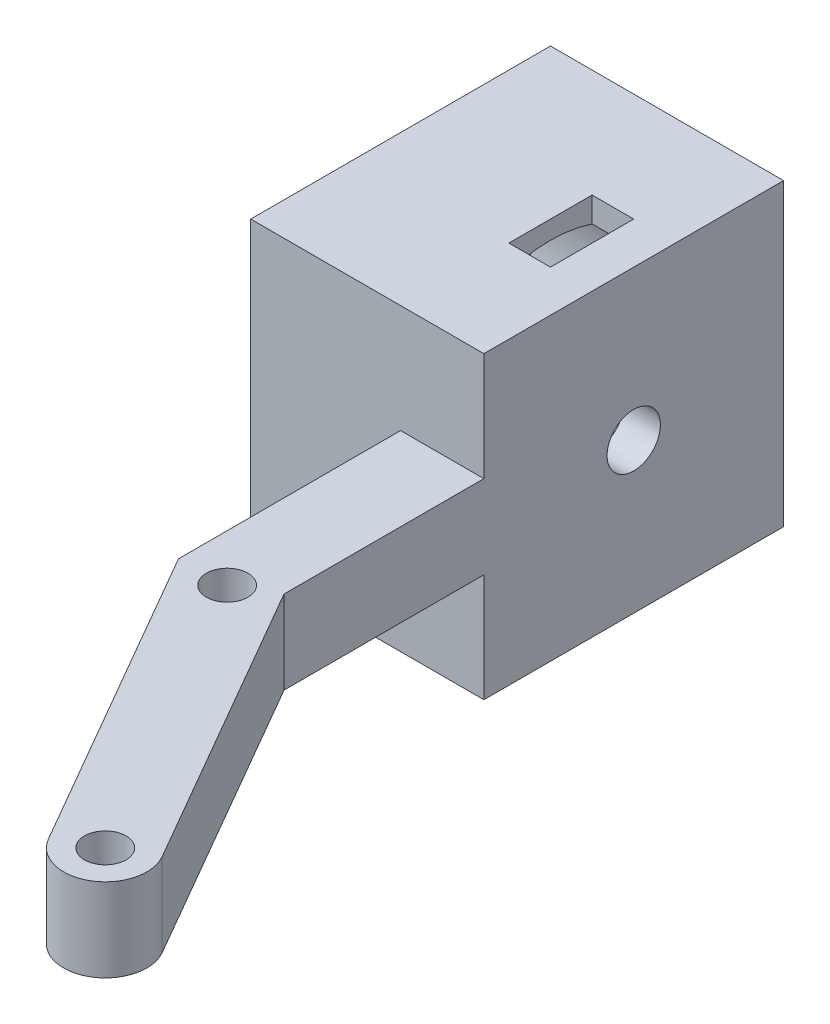
ISO-10303-21;
HEADER;
FILE_DESCRIPTION(('STEP AP214'),'2;1');
FILE_NAME('part.step','',(''),(''),'','','');
FILE_SCHEMA(('AUTOMOTIVE_DESIGN { 1 0 10303 214 1 1 1 1 }'));
ENDSEC;
DATA;
#1=APPLICATION_CONTEXT('core data for automotive mechanical design processes');
#2=APPLICATION_PROTOCOL_DEFINITION('international standard','automotive_design',2000,#1);
#3=PRODUCT_CONTEXT('',#1,'mechanical');
#4=PRODUCT('Part','Part','',(#3));
#5=PRODUCT_RELATED_PRODUCT_CATEGORY('part','',(#4));
#6=PRODUCT_DEFINITION_FORMATION('','',#4);
#7=PRODUCT_DEFINITION_CONTEXT('part definition',#1,'design');
#8=PRODUCT_DEFINITION('design','',#6,#7);
#9=PRODUCT_DEFINITION_SHAPE('','',#8);
#10=(LENGTH_UNIT() NAMED_UNIT(*) SI_UNIT(.MILLI.,.METRE.));
#11=(NAMED_UNIT(*) PLANE_ANGLE_UNIT() SI_UNIT($,.RADIAN.));
#12=(NAMED_UNIT(*) SI_UNIT($,.STERADIAN.) SOLID_ANGLE_UNIT());
#13=UNCERTAINTY_MEASURE_WITH_UNIT(LENGTH_MEASURE(1.E-05),#10,'distance_accuracy_value','');
#14=(GEOMETRIC_REPRESENTATION_CONTEXT(3) GLOBAL_UNCERTAINTY_ASSIGNED_CONTEXT((#13)) GLOBAL_UNIT_ASSIGNED_CONTEXT((#10,
#11,#12)) REPRESENTATION_CONTEXT('',''));
#15=CARTESIAN_POINT('',(0.,0.,0.));
#16=DIRECTION('',(0.,0.,1.));
#17=DIRECTION('',(1.,0.,0.));
#18=AXIS2_PLACEMENT_3D('',#15,#16,#17);
#19=CARTESIAN_POINT('',(-6.35,22.86,14.4014773719376));
#20=DIRECTION('',(0.866025403784442,0.,-0.499999999999995));
#21=DIRECTION('',(-0.499999999999995,0.,-0.866025403784442));
#22=AXIS2_PLACEMENT_3D('',#19,#20,#21);
#23=PLANE('',#22);
#24=DIRECTION('',(-0.5,0.,-0.866025403784439));
#25=VECTOR('',#24,1.);
#26=CARTESIAN_POINT('',(-6.35,8.255,14.4014773719376));
#27=LINE('',#26,#25);
#28=CARTESIAN_POINT('',(7.20073868596881,8.255,37.8720452561247));
#29=VERTEX_POINT('',#28);
#30=CARTESIAN_POINT('',(-6.35,8.255,14.4014773719376));
#31=VERTEX_POINT('',#30);
#32=EDGE_CURVE('E210',#29,#31,#27,.T.);
#33=ORIENTED_EDGE('',*,*,#32,.F.);
#34=DIRECTION('',(0.,-1.,0.));
#35=VECTOR('',#34,1.);
#36=CARTESIAN_POINT('',(7.20073868596866,22.86,37.8720452561248));
#37=LINE('',#36,#35);
#38=CARTESIAN_POINT('',(7.20073868596881,14.605,37.8720452561247));
#39=VERTEX_POINT('',#38);
#40=EDGE_CURVE('E11',#39,#29,#37,.T.);
#41=ORIENTED_EDGE('',*,*,#40,.F.);
#42=DIRECTION('',(0.5,0.,0.866025403784438));
#43=VECTOR('',#42,1.);
#44=CARTESIAN_POINT('',(-6.35,14.605,14.4014773719376));
#45=LINE('',#44,#43);
#46=CARTESIAN_POINT('',(-6.35,14.605,14.4014773719376));
#47=VERTEX_POINT('',#46);
#48=EDGE_CURVE('E241',#47,#39,#45,.T.);
#49=ORIENTED_EDGE('',*,*,#48,.F.);
#50=DIRECTION('',(0.,-1.,0.));
#51=VECTOR('',#50,1.);
#52=CARTESIAN_POINT('',(-6.35,22.86,14.4014773719376));
#53=LINE('',#52,#51);
#54=EDGE_CURVE('E274',#47,#31,#53,.T.);
#55=ORIENTED_EDGE('',*,*,#54,.T.);
#56=EDGE_LOOP('',(#33,#41,#49,#55));
#57=FACE_BOUND('',#56,.T.);
#58=ADVANCED_FACE('F45',(#57),#23,.F.);
#59=CARTESIAN_POINT('',(9.95036934298427,22.86,36.2845452561248));
#60=DIRECTION('',(0.,-1.,0.));
#61=DIRECTION('',(0.,0.,-1.));
#62=AXIS2_PLACEMENT_3D('',#59,#60,#61);
#63=CYLINDRICAL_SURFACE('',#62,3.175);
#64=CARTESIAN_POINT('',(9.95036934298427,8.255,36.2845452561248));
#65=DIRECTION('',(0.,-1.,0.));
#66=DIRECTION('',(0.,0.,-1.));
#67=AXIS2_PLACEMENT_3D('',#64,#65,#66);
#68=CIRCLE('',#67,3.175);
#69=CARTESIAN_POINT('',(12.6999999999999,8.255,34.6970452561248));
#70=VERTEX_POINT('',#69);
#71=EDGE_CURVE('E228',#70,#29,#68,.T.);
#72=ORIENTED_EDGE('',*,*,#71,.F.);
#73=DIRECTION('',(0.,-1.,0.));
#74=VECTOR('',#73,1.);
#75=CARTESIAN_POINT('',(12.6999999999999,22.86,34.6970452561248));
#76=LINE('',#75,#74);
#77=CARTESIAN_POINT('',(12.6999999999999,14.605,34.6970452561248));
#78=VERTEX_POINT('',#77);
#79=EDGE_CURVE('E54',#78,#70,#76,.T.);
#80=ORIENTED_EDGE('',*,*,#79,.F.);
#81=CARTESIAN_POINT('',(9.95036934298427,14.605,36.2845452561248));
#82=DIRECTION('',(0.,1.,0.));
#83=DIRECTION('',(0.,0.,1.));
#84=AXIS2_PLACEMENT_3D('',#81,#82,#83);
#85=CIRCLE('',#84,3.175);
#86=EDGE_CURVE('E257',#39,#78,#85,.T.);
#87=ORIENTED_EDGE('',*,*,#86,.F.);
#88=ORIENTED_EDGE('',*,*,#40,.T.);
#89=EDGE_LOOP('',(#72,#80,#87,#88));
#90=FACE_BOUND('',#89,.T.);
#91=ADVANCED_FACE('F335',(#90),#63,.T.);
#92=CARTESIAN_POINT('',(0.,22.86,12.7));
#93=DIRECTION('',(-0.866025403784441,0.,0.499999999999995));
#94=DIRECTION('',(0.499999999999995,0.,0.866025403784442));
#95=AXIS2_PLACEMENT_3D('',#92,#93,#94);
#96=PLANE('',#95);
#97=DIRECTION('',(0.499999999999995,0.,0.866025403784441));
#98=VECTOR('',#97,1.);
#99=CARTESIAN_POINT('',(0.,8.255,12.7));
#100=LINE('',#99,#98);
#101=CARTESIAN_POINT('',(0.,8.255,12.7));
#102=VERTEX_POINT('',#101);
#103=EDGE_CURVE('E207',#102,#70,#100,.T.);
#104=ORIENTED_EDGE('',*,*,#103,.F.);
#105=DIRECTION('',(0.,-1.,0.));
#106=VECTOR('',#105,1.);
#107=CARTESIAN_POINT('',(0.,22.86,12.7));
#108=LINE('',#107,#106);
#109=CARTESIAN_POINT('',(0.,14.605,12.7));
#110=VERTEX_POINT('',#109);
#111=EDGE_CURVE('E304',#110,#102,#108,.T.);
#112=ORIENTED_EDGE('',*,*,#111,.F.);
#113=DIRECTION('',(-0.499999999999996,0.,-0.866025403784441));
#114=VECTOR('',#113,1.);
#115=CARTESIAN_POINT('',(0.,14.605,12.7));
#116=LINE('',#115,#114);
#117=EDGE_CURVE('E245',#78,#110,#116,.T.);
#118=ORIENTED_EDGE('',*,*,#117,.F.);
#119=ORIENTED_EDGE('',*,*,#79,.T.);
#120=EDGE_LOOP('',(#104,#112,#118,#119));
#121=FACE_BOUND('',#120,.T.);
#122=ADVANCED_FACE('F333',(#121),#96,.F.);
#123=CARTESIAN_POINT('',(-6.35,22.86,14.4014773719376));
#124=DIRECTION('',(1.,0.,0.));
#125=DIRECTION('',(0.,0.,-1.));
#126=AXIS2_PLACEMENT_3D('',#123,#124,#125);
#127=PLANE('',#126);
#128=DIRECTION('',(0.,0.,-1.));
#129=VECTOR('',#128,1.);
#130=CARTESIAN_POINT('',(-6.35,8.255,-2.54));
#131=LINE('',#130,#129);
#132=CARTESIAN_POINT('',(-6.35,8.255,-2.54));
#133=VERTEX_POINT('',#132);
#134=EDGE_CURVE('E213',#31,#133,#131,.T.);
#135=ORIENTED_EDGE('',*,*,#134,.F.);
#136=ORIENTED_EDGE('',*,*,#54,.F.);
#137=DIRECTION('',(0.,0.,1.));
#138=VECTOR('',#137,1.);
#139=CARTESIAN_POINT('',(-6.35,14.605,14.4014773719376));
#140=LINE('',#139,#138);
#141=CARTESIAN_POINT('',(-6.35,14.605,-2.54));
#142=VERTEX_POINT('',#141);
#143=EDGE_CURVE('E238',#142,#47,#140,.T.);
#144=ORIENTED_EDGE('',*,*,#143,.F.);
#145=DIRECTION('',(0.,-1.,0.));
#146=VECTOR('',#145,1.);
#147=CARTESIAN_POINT('',(-6.35,22.86,-2.54));
#148=LINE('',#147,#146);
#149=EDGE_CURVE('E288',#142,#133,#148,.T.);
#150=ORIENTED_EDGE('',*,*,#149,.T.);
#151=EDGE_LOOP('',(#135,#136,#144,#150));
#152=FACE_BOUND('',#151,.T.);
#153=ADVANCED_FACE('F343',(#152),#127,.F.);
#154=CARTESIAN_POINT('',(9.95036934298427,22.86,36.2845452561248));
#155=DIRECTION('',(0.,-1.,0.));
#156=DIRECTION('',(0.,0.,-1.));
#157=AXIS2_PLACEMENT_3D('',#154,#155,#156);
#158=CYLINDRICAL_SURFACE('',#157,1.5875);
#159=CARTESIAN_POINT('',(9.95036934298427,14.605,36.2845452561248));
#160=DIRECTION('',(0.,1.,0.));
#161=DIRECTION('',(0.,0.,1.));
#162=AXIS2_PLACEMENT_3D('',#159,#160,#161);
#163=CIRCLE('',#162,1.5875);
#164=CARTESIAN_POINT('',(9.95036934298427,14.605,37.8720452561248));
#165=VERTEX_POINT('',#164);
#166=EDGE_CURVE('E253',#165,#165,#163,.T.);
#167=ORIENTED_EDGE('',*,*,#166,.T.);
#168=EDGE_LOOP('',(#167));
#169=FACE_BOUND('',#168,.T.);
#170=CARTESIAN_POINT('',(9.95036934298427,8.255,36.2845452561248));
#171=DIRECTION('',(0.,-1.,0.));
#172=DIRECTION('',(0.,0.,-1.));
#173=AXIS2_PLACEMENT_3D('',#170,#171,#172);
#174=CIRCLE('',#173,1.5875);
#175=CARTESIAN_POINT('',(9.95036934298427,8.255,34.6970452561248));
#176=VERTEX_POINT('',#175);
#177=EDGE_CURVE('E224',#176,#176,#174,.T.);
#178=ORIENTED_EDGE('',*,*,#177,.T.);
#179=EDGE_LOOP('',(#178));
#180=FACE_BOUND('',#179,.T.);
#181=ADVANCED_FACE('F375',(#169,#180),#158,.F.);
#182=CARTESIAN_POINT('',(-2.7496306570156,22.86,14.2875));
#183=DIRECTION('',(0.,-1.,0.));
#184=DIRECTION('',(0.,0.,-1.));
#185=AXIS2_PLACEMENT_3D('',#182,#183,#184);
#186=CYLINDRICAL_SURFACE('',#185,1.5875);
#187=CARTESIAN_POINT('',(-2.7496306570156,14.605,14.2875));
#188=DIRECTION('',(0.,1.,0.));
#189=DIRECTION('',(0.,0.,1.));
#190=AXIS2_PLACEMENT_3D('',#187,#188,#189);
#191=CIRCLE('',#190,1.5875);
#192=CARTESIAN_POINT('',(-2.7496306570156,14.605,15.875));
#193=VERTEX_POINT('',#192);
#194=EDGE_CURVE('E252',#193,#193,#191,.T.);
#195=ORIENTED_EDGE('',*,*,#194,.T.);
#196=EDGE_LOOP('',(#195));
#197=FACE_BOUND('',#196,.T.);
#198=CARTESIAN_POINT('',(-2.7496306570156,8.255,14.2875));
#199=DIRECTION('',(0.,-1.,0.));
#200=DIRECTION('',(0.,0.,-1.));
#201=AXIS2_PLACEMENT_3D('',#198,#199,#200);
#202=CIRCLE('',#201,1.5875);
#203=CARTESIAN_POINT('',(-2.7496306570156,8.255,12.7));
#204=VERTEX_POINT('',#203);
#205=EDGE_CURVE('E220',#204,#204,#202,.T.);
#206=ORIENTED_EDGE('',*,*,#205,.T.);
#207=EDGE_LOOP('',(#206));
#208=FACE_BOUND('',#207,.T.);
#209=ADVANCED_FACE('F314',(#197,#208),#186,.F.);
#210=CARTESIAN_POINT('',(9.95036934298427,22.86,36.2845452561248));
#211=DIRECTION('',(0.,1.,0.));
#212=DIRECTION('',(0.,0.,1.));
#213=AXIS2_PLACEMENT_3D('',#210,#211,#212);
#214=PLANE('',#213);
#215=DIRECTION('',(-1.,0.,0.));
#216=VECTOR('',#215,1.);
#217=CARTESIAN_POINT('',(-6.35,22.86,-17.145));
#218=LINE('',#217,#216);
#219=CARTESIAN_POINT('',(-3.175,22.86,-17.145));
#220=VERTEX_POINT('',#219);
#221=CARTESIAN_POINT('',(-6.35,22.86,-17.145));
#222=VERTEX_POINT('',#221);
#223=EDGE_CURVE('E150',#220,#222,#218,.T.);
#224=ORIENTED_EDGE('',*,*,#223,.F.);
#225=DIRECTION('',(0.,0.,-1.));
#226=VECTOR('',#225,1.);
#227=CARTESIAN_POINT('',(-3.175,22.86,-10.795));
#228=LINE('',#227,#226);
#229=CARTESIAN_POINT('',(-3.175,22.86,-10.795));
#230=VERTEX_POINT('',#229);
#231=EDGE_CURVE('E159',#230,#220,#228,.T.);
#232=ORIENTED_EDGE('',*,*,#231,.F.);
#233=DIRECTION('',(1.,0.,0.));
#234=VECTOR('',#233,1.);
#235=CARTESIAN_POINT('',(-6.35,22.86,-10.795));
#236=LINE('',#235,#234);
#237=CARTESIAN_POINT('',(-6.35,22.86,-10.795));
#238=VERTEX_POINT('',#237);
#239=EDGE_CURVE('E62',#238,#230,#236,.T.);
#240=ORIENTED_EDGE('',*,*,#239,.F.);
#241=DIRECTION('',(0.,0.,1.));
#242=VECTOR('',#241,1.);
#243=CARTESIAN_POINT('',(-6.35,22.86,-10.795));
#244=LINE('',#243,#242);
#245=EDGE_CURVE('E169',#222,#238,#244,.T.);
#246=ORIENTED_EDGE('',*,*,#245,.F.);
#247=EDGE_LOOP('',(#224,#232,#240,#246));
#248=FACE_BOUND('',#247,.T.);
#249=DIRECTION('',(1.,0.,0.));
#250=VECTOR('',#249,1.);
#251=CARTESIAN_POINT('',(-17.78,22.86,-2.54));
#252=LINE('',#251,#250);
#253=CARTESIAN_POINT('',(-17.78,22.86,-2.54));
#254=VERTEX_POINT('',#253);
#255=CARTESIAN_POINT('',(0.,22.86,-2.54));
#256=VERTEX_POINT('',#255);
#257=EDGE_CURVE('E271',#254,#256,#252,.T.);
#258=ORIENTED_EDGE('',*,*,#257,.T.);
#259=DIRECTION('',(0.,0.,-1.));
#260=VECTOR('',#259,1.);
#261=CARTESIAN_POINT('',(0.,22.86,12.7));
#262=LINE('',#261,#260);
#263=CARTESIAN_POINT('',(0.,22.86,-25.4));
#264=VERTEX_POINT('',#263);
#265=EDGE_CURVE('E261',#256,#264,#262,.T.);
#266=ORIENTED_EDGE('',*,*,#265,.T.);
#267=DIRECTION('',(-1.,0.,0.));
#268=VECTOR('',#267,1.);
#269=CARTESIAN_POINT('',(0.,22.86,-25.4));
#270=LINE('',#269,#268);
#271=CARTESIAN_POINT('',(-17.78,22.86,-25.4));
#272=VERTEX_POINT('',#271);
#273=EDGE_CURVE('E264',#264,#272,#270,.T.);
#274=ORIENTED_EDGE('',*,*,#273,.T.);
#275=DIRECTION('',(0.,0.,1.));
#276=VECTOR('',#275,1.);
#277=CARTESIAN_POINT('',(-17.78,22.86,-25.4));
#278=LINE('',#277,#276);
#279=EDGE_CURVE('E268',#272,#254,#278,.T.);
#280=ORIENTED_EDGE('',*,*,#279,.T.);
#281=EDGE_LOOP('',(#258,#266,#274,#280));
#282=FACE_BOUND('',#281,.T.);
#283=ADVANCED_FACE('F166',(#248,#282),#214,.T.);
#284=CARTESIAN_POINT('',(9.95036934298427,0.,36.2845452561248));
#285=DIRECTION('',(0.,1.,0.));
#286=DIRECTION('',(0.,0.,1.));
#287=AXIS2_PLACEMENT_3D('',#284,#285,#286);
#288=PLANE('',#287);
#289=DIRECTION('',(0.,0.,-1.));
#290=VECTOR('',#289,1.);
#291=CARTESIAN_POINT('',(0.,0.,12.7));
#292=LINE('',#291,#290);
#293=CARTESIAN_POINT('',(0.,0.,-2.54));
#294=VERTEX_POINT('',#293);
#295=CARTESIAN_POINT('',(0.,0.,-25.4));
#296=VERTEX_POINT('',#295);
#297=EDGE_CURVE('E260',#294,#296,#292,.T.);
#298=ORIENTED_EDGE('',*,*,#297,.F.);
#299=DIRECTION('',(1.,0.,0.));
#300=VECTOR('',#299,1.);
#301=CARTESIAN_POINT('',(-17.78,0.,-2.54));
#302=LINE('',#301,#300);
#303=CARTESIAN_POINT('',(-17.78,0.,-2.54));
#304=VERTEX_POINT('',#303);
#305=EDGE_CURVE('E265',#304,#294,#302,.T.);
#306=ORIENTED_EDGE('',*,*,#305,.F.);
#307=DIRECTION('',(0.,0.,1.));
#308=VECTOR('',#307,1.);
#309=CARTESIAN_POINT('',(-17.78,0.,-25.4));
#310=LINE('',#309,#308);
#311=CARTESIAN_POINT('',(-17.78,0.,-25.4));
#312=VERTEX_POINT('',#311);
#313=EDGE_CURVE('E280',#312,#304,#310,.T.);
#314=ORIENTED_EDGE('',*,*,#313,.F.);
#315=DIRECTION('',(-1.,0.,0.));
#316=VECTOR('',#315,1.);
#317=CARTESIAN_POINT('',(0.,0.,-25.4));
#318=LINE('',#317,#316);
#319=EDGE_CURVE('E277',#296,#312,#318,.T.);
#320=ORIENTED_EDGE('',*,*,#319,.F.);
#321=EDGE_LOOP('',(#298,#306,#314,#320));
#322=FACE_BOUND('',#321,.T.);
#323=ADVANCED_FACE('F355',(#322),#288,.F.);
#324=CARTESIAN_POINT('',(0.,22.86,12.7));
#325=DIRECTION('',(-1.,0.,0.));
#326=DIRECTION('',(0.,0.,1.));
#327=AXIS2_PLACEMENT_3D('',#324,#325,#326);
#328=PLANE('',#327);
#329=CARTESIAN_POINT('',(0.,11.43,-13.97));
#330=DIRECTION('',(1.,0.,0.));
#331=DIRECTION('',(0.,0.,-1.));
#332=AXIS2_PLACEMENT_3D('',#329,#330,#331);
#333=CIRCLE('',#332,2.032);
#334=CARTESIAN_POINT('',(0.,11.43,-16.002));
#335=VERTEX_POINT('',#334);
#336=EDGE_CURVE('E180',#335,#335,#333,.T.);
#337=ORIENTED_EDGE('',*,*,#336,.F.);
#338=EDGE_LOOP('',(#337));
#339=FACE_BOUND('',#338,.T.);
#340=DIRECTION('',(0.,0.,1.));
#341=VECTOR('',#340,1.);
#342=CARTESIAN_POINT('',(0.,8.255,-2.54));
#343=LINE('',#342,#341);
#344=CARTESIAN_POINT('',(0.,8.255,-2.54));
#345=VERTEX_POINT('',#344);
#346=EDGE_CURVE('E204',#345,#102,#343,.T.);
#347=ORIENTED_EDGE('',*,*,#346,.F.);
#348=DIRECTION('',(0.,-1.,0.));
#349=VECTOR('',#348,1.);
#350=CARTESIAN_POINT('',(0.,8.255,-2.54));
#351=LINE('',#350,#349);
#352=EDGE_CURVE('E216',#345,#294,#351,.T.);
#353=ORIENTED_EDGE('',*,*,#352,.T.);
#354=ORIENTED_EDGE('',*,*,#297,.T.);
#355=DIRECTION('',(0.,-1.,0.));
#356=VECTOR('',#355,1.);
#357=CARTESIAN_POINT('',(0.,22.86,-25.4));
#358=LINE('',#357,#356);
#359=EDGE_CURVE('E300',#264,#296,#358,.T.);
#360=ORIENTED_EDGE('',*,*,#359,.F.);
#361=ORIENTED_EDGE('',*,*,#265,.F.);
#362=DIRECTION('',(0.,1.,0.));
#363=VECTOR('',#362,1.);
#364=CARTESIAN_POINT('',(0.,14.605,-2.54));
#365=LINE('',#364,#363);
#366=CARTESIAN_POINT('',(0.,14.605,-2.54));
#367=VERTEX_POINT('',#366);
#368=EDGE_CURVE('E248',#367,#256,#365,.T.);
#369=ORIENTED_EDGE('',*,*,#368,.F.);
#370=DIRECTION('',(0.,0.,-1.));
#371=VECTOR('',#370,1.);
#372=CARTESIAN_POINT('',(0.,14.605,-2.54));
#373=LINE('',#372,#371);
#374=EDGE_CURVE('E231',#110,#367,#373,.T.);
#375=ORIENTED_EDGE('',*,*,#374,.F.);
#376=ORIENTED_EDGE('',*,*,#111,.T.);
#377=EDGE_LOOP('',(#347,#353,#354,#360,#361,#369,#375,#376));
#378=FACE_BOUND('',#377,.T.);
#379=ADVANCED_FACE('F351',(#339,#378),#328,.F.);
#380=CARTESIAN_POINT('',(0.,22.86,-25.4));
#381=DIRECTION('',(0.,0.,1.));
#382=DIRECTION('',(1.,0.,0.));
#383=AXIS2_PLACEMENT_3D('',#380,#381,#382);
#384=PLANE('',#383);
#385=ORIENTED_EDGE('',*,*,#319,.T.);
#386=DIRECTION('',(0.,-1.,0.));
#387=VECTOR('',#386,1.);
#388=CARTESIAN_POINT('',(-17.78,22.86,-25.4));
#389=LINE('',#388,#387);
#390=EDGE_CURVE('E296',#272,#312,#389,.T.);
#391=ORIENTED_EDGE('',*,*,#390,.F.);
#392=ORIENTED_EDGE('',*,*,#273,.F.);
#393=ORIENTED_EDGE('',*,*,#359,.T.);
#394=EDGE_LOOP('',(#385,#391,#392,#393));
#395=FACE_BOUND('',#394,.T.);
#396=ADVANCED_FACE('F359',(#395),#384,.F.);
#397=CARTESIAN_POINT('',(-17.78,22.86,-25.4));
#398=DIRECTION('',(1.,0.,0.));
#399=DIRECTION('',(0.,0.,-1.));
#400=AXIS2_PLACEMENT_3D('',#397,#398,#399);
#401=PLANE('',#400);
#402=CARTESIAN_POINT('',(-17.78,11.43,-13.97));
#403=DIRECTION('',(-1.,0.,0.));
#404=DIRECTION('',(0.,0.,1.));
#405=AXIS2_PLACEMENT_3D('',#402,#403,#404);
#406=CIRCLE('',#405,10.033);
#407=CARTESIAN_POINT('',(-17.78,11.43,-3.937));
#408=VERTEX_POINT('',#407);
#409=EDGE_CURVE('E197',#408,#408,#406,.T.);
#410=ORIENTED_EDGE('',*,*,#409,.F.);
#411=EDGE_LOOP('',(#410));
#412=FACE_BOUND('',#411,.T.);
#413=ORIENTED_EDGE('',*,*,#313,.T.);
#414=DIRECTION('',(0.,-1.,0.));
#415=VECTOR('',#414,1.);
#416=CARTESIAN_POINT('',(-17.78,22.86,-2.54));
#417=LINE('',#416,#415);
#418=EDGE_CURVE('E292',#254,#304,#417,.T.);
#419=ORIENTED_EDGE('',*,*,#418,.F.);
#420=ORIENTED_EDGE('',*,*,#279,.F.);
#421=ORIENTED_EDGE('',*,*,#390,.T.);
#422=EDGE_LOOP('',(#413,#419,#420,#421));
#423=FACE_BOUND('',#422,.T.);
#424=ADVANCED_FACE('F363',(#412,#423),#401,.F.);
#425=CARTESIAN_POINT('',(-17.78,22.86,-2.54));
#426=DIRECTION('',(0.,0.,-1.));
#427=DIRECTION('',(-1.,0.,0.));
#428=AXIS2_PLACEMENT_3D('',#425,#426,#427);
#429=PLANE('',#428);
#430=ORIENTED_EDGE('',*,*,#305,.T.);
#431=ORIENTED_EDGE('',*,*,#352,.F.);
#432=DIRECTION('',(1.,0.,0.));
#433=VECTOR('',#432,1.);
#434=CARTESIAN_POINT('',(-6.35,8.255,-2.54));
#435=LINE('',#434,#433);
#436=EDGE_CURVE('E196',#133,#345,#435,.T.);
#437=ORIENTED_EDGE('',*,*,#436,.F.);
#438=ORIENTED_EDGE('',*,*,#149,.F.);
#439=DIRECTION('',(-1.,0.,0.));
#440=VECTOR('',#439,1.);
#441=CARTESIAN_POINT('',(-6.35,14.605,-2.54));
#442=LINE('',#441,#440);
#443=EDGE_CURVE('E235',#367,#142,#442,.T.);
#444=ORIENTED_EDGE('',*,*,#443,.F.);
#445=ORIENTED_EDGE('',*,*,#368,.T.);
#446=ORIENTED_EDGE('',*,*,#257,.F.);
#447=ORIENTED_EDGE('',*,*,#418,.T.);
#448=EDGE_LOOP('',(#430,#431,#437,#438,#444,#445,#446,#447));
#449=FACE_BOUND('',#448,.T.);
#450=ADVANCED_FACE('F321',(#449),#429,.F.);
#451=CARTESIAN_POINT('',(0.,14.605,0.));
#452=DIRECTION('',(0.,1.,0.));
#453=DIRECTION('',(0.,0.,1.));
#454=AXIS2_PLACEMENT_3D('',#451,#452,#453);
#455=PLANE('',#454);
#456=ORIENTED_EDGE('',*,*,#166,.F.);
#457=EDGE_LOOP('',(#456));
#458=FACE_BOUND('',#457,.T.);
#459=ORIENTED_EDGE('',*,*,#194,.F.);
#460=EDGE_LOOP('',(#459));
#461=FACE_BOUND('',#460,.T.);
#462=ORIENTED_EDGE('',*,*,#86,.T.);
#463=ORIENTED_EDGE('',*,*,#117,.T.);
#464=ORIENTED_EDGE('',*,*,#374,.T.);
#465=ORIENTED_EDGE('',*,*,#443,.T.);
#466=ORIENTED_EDGE('',*,*,#143,.T.);
#467=ORIENTED_EDGE('',*,*,#48,.T.);
#468=EDGE_LOOP('',(#462,#463,#464,#465,#466,#467));
#469=FACE_BOUND('',#468,.T.);
#470=ADVANCED_FACE('F317',(#458,#461,#469),#455,.T.);
#471=CARTESIAN_POINT('',(0.,8.255,0.));
#472=DIRECTION('',(0.,-1.,0.));
#473=DIRECTION('',(0.,0.,-1.));
#474=AXIS2_PLACEMENT_3D('',#471,#472,#473);
#475=PLANE('',#474);
#476=ORIENTED_EDGE('',*,*,#177,.F.);
#477=EDGE_LOOP('',(#476));
#478=FACE_BOUND('',#477,.T.);
#479=ORIENTED_EDGE('',*,*,#205,.F.);
#480=EDGE_LOOP('',(#479));
#481=FACE_BOUND('',#480,.T.);
#482=ORIENTED_EDGE('',*,*,#71,.T.);
#483=ORIENTED_EDGE('',*,*,#32,.T.);
#484=ORIENTED_EDGE('',*,*,#134,.T.);
#485=ORIENTED_EDGE('',*,*,#436,.T.);
#486=ORIENTED_EDGE('',*,*,#346,.T.);
#487=ORIENTED_EDGE('',*,*,#103,.T.);
#488=EDGE_LOOP('',(#482,#483,#484,#485,#486,#487));
#489=FACE_BOUND('',#488,.T.);
#490=ADVANCED_FACE('F320',(#478,#481,#489),#475,.T.);
#491=CARTESIAN_POINT('',(-2.794,11.43,-13.97));
#492=DIRECTION('',(-1.,0.,0.));
#493=DIRECTION('',(0.,0.,1.));
#494=AXIS2_PLACEMENT_3D('',#491,#492,#493);
#495=CYLINDRICAL_SURFACE('',#494,10.033);
#496=CARTESIAN_POINT('',(-3.175,11.43,-13.97));
#497=DIRECTION('',(1.,0.,0.));
#498=DIRECTION('',(0.,0.,-1.));
#499=AXIS2_PLACEMENT_3D('',#496,#497,#498);
#500=CIRCLE('',#499,10.033);
#501=CARTESIAN_POINT('',(-3.175,20.9473769495592,-17.145));
#502=VERTEX_POINT('',#501);
#503=CARTESIAN_POINT('',(-3.175,20.9473769495591,-10.795));
#504=VERTEX_POINT('',#503);
#505=EDGE_CURVE('E164',#502,#504,#500,.T.);
#506=ORIENTED_EDGE('',*,*,#505,.F.);
#507=DIRECTION('',(-1.,0.,0.));
#508=VECTOR('',#507,1.);
#509=CARTESIAN_POINT('',(-2.794,20.9473769495592,-17.145));
#510=LINE('',#509,#508);
#511=CARTESIAN_POINT('',(-6.35,20.9473769495591,-17.145));
#512=VERTEX_POINT('',#511);
#513=EDGE_CURVE('E70',#512,#502,#510,.F.);
#514=ORIENTED_EDGE('',*,*,#513,.F.);
#515=CARTESIAN_POINT('',(-6.35,11.43,-13.97));
#516=DIRECTION('',(-1.,0.,0.));
#517=DIRECTION('',(0.,0.,1.));
#518=AXIS2_PLACEMENT_3D('',#515,#516,#517);
#519=CIRCLE('',#518,10.033);
#520=CARTESIAN_POINT('',(-6.35,20.9473769495591,-10.795));
#521=VERTEX_POINT('',#520);
#522=EDGE_CURVE('E188',#521,#512,#519,.T.);
#523=ORIENTED_EDGE('',*,*,#522,.F.);
#524=DIRECTION('',(-1.,0.,0.));
#525=VECTOR('',#524,1.);
#526=CARTESIAN_POINT('',(-2.794,20.9473769495591,-10.795));
#527=LINE('',#526,#525);
#528=EDGE_CURVE('E435',#504,#521,#527,.T.);
#529=ORIENTED_EDGE('',*,*,#528,.F.);
#530=EDGE_LOOP('',(#506,#514,#523,#529));
#531=FACE_BOUND('',#530,.T.);
#532=CARTESIAN_POINT('',(-2.794,11.43,-13.97));
#533=DIRECTION('',(-1.,0.,0.));
#534=DIRECTION('',(0.,0.,1.));
#535=AXIS2_PLACEMENT_3D('',#532,#533,#534);
#536=CIRCLE('',#535,10.033);
#537=CARTESIAN_POINT('',(-2.794,11.43,-3.937));
#538=VERTEX_POINT('',#537);
#539=EDGE_CURVE('E192',#538,#538,#536,.T.);
#540=ORIENTED_EDGE('',*,*,#539,.F.);
#541=EDGE_LOOP('',(#540));
#542=FACE_BOUND('',#541,.T.);
#543=ORIENTED_EDGE('',*,*,#409,.T.);
#544=EDGE_LOOP('',(#543));
#545=FACE_BOUND('',#544,.T.);
#546=ADVANCED_FACE('F408',(#531,#542,#545),#495,.F.);
#547=CARTESIAN_POINT('',(-2.79399999999999,0.,0.));
#548=DIRECTION('',(-1.,0.,0.));
#549=DIRECTION('',(0.,0.,1.));
#550=AXIS2_PLACEMENT_3D('',#547,#548,#549);
#551=PLANE('',#550);
#552=CARTESIAN_POINT('',(-2.794,11.43,-13.97));
#553=DIRECTION('',(-1.,0.,0.));
#554=DIRECTION('',(0.,0.,1.));
#555=AXIS2_PLACEMENT_3D('',#552,#553,#554);
#556=CIRCLE('',#555,2.032);
#557=CARTESIAN_POINT('',(-2.794,11.43,-11.938));
#558=VERTEX_POINT('',#557);
#559=EDGE_CURVE('E48',#558,#558,#556,.T.);
#560=ORIENTED_EDGE('',*,*,#559,.F.);
#561=EDGE_LOOP('',(#560));
#562=FACE_BOUND('',#561,.T.);
#563=ORIENTED_EDGE('',*,*,#539,.T.);
#564=EDGE_LOOP('',(#563));
#565=FACE_BOUND('',#564,.T.);
#566=ADVANCED_FACE('F412',(#562,#565),#551,.T.);
#567=CARTESIAN_POINT('',(-17.78,11.43,-13.97));
#568=DIRECTION('',(1.,0.,0.));
#569=DIRECTION('',(0.,0.,-1.));
#570=AXIS2_PLACEMENT_3D('',#567,#568,#569);
#571=CYLINDRICAL_SURFACE('',#570,2.032);
#572=ORIENTED_EDGE('',*,*,#559,.T.);
#573=EDGE_LOOP('',(#572));
#574=FACE_BOUND('',#573,.T.);
#575=ORIENTED_EDGE('',*,*,#336,.T.);
#576=EDGE_LOOP('',(#575));
#577=FACE_BOUND('',#576,.T.);
#578=ADVANCED_FACE('F416',(#574,#577),#571,.F.);
#579=CARTESIAN_POINT('',(-6.35,-0.001000000000001,-17.145));
#580=DIRECTION('',(0.,0.,-1.));
#581=DIRECTION('',(-1.,0.,0.));
#582=AXIS2_PLACEMENT_3D('',#579,#580,#581);
#583=PLANE('',#582);
#584=ORIENTED_EDGE('',*,*,#513,.T.);
#585=DIRECTION('',(0.,1.,0.));
#586=VECTOR('',#585,1.);
#587=CARTESIAN_POINT('',(-3.175,-0.001000000000001,-17.145));
#588=LINE('',#587,#586);
#589=EDGE_CURVE('E146',#502,#220,#588,.T.);
#590=ORIENTED_EDGE('',*,*,#589,.T.);
#591=ORIENTED_EDGE('',*,*,#223,.T.);
#592=DIRECTION('',(0.,1.,0.));
#593=VECTOR('',#592,1.);
#594=CARTESIAN_POINT('',(-6.35,-0.001000000000001,-17.145));
#595=LINE('',#594,#593);
#596=EDGE_CURVE('E156',#512,#222,#595,.T.);
#597=ORIENTED_EDGE('',*,*,#596,.F.);
#598=EDGE_LOOP('',(#584,#590,#591,#597));
#599=FACE_BOUND('',#598,.T.);
#600=ADVANCED_FACE('F148',(#599),#583,.F.);
#601=CARTESIAN_POINT('',(-6.35,-0.001000000000001,-10.795));
#602=DIRECTION('',(-1.,0.,0.));
#603=DIRECTION('',(0.,0.,1.));
#604=AXIS2_PLACEMENT_3D('',#601,#602,#603);
#605=PLANE('',#604);
#606=ORIENTED_EDGE('',*,*,#522,.T.);
#607=ORIENTED_EDGE('',*,*,#596,.T.);
#608=ORIENTED_EDGE('',*,*,#245,.T.);
#609=DIRECTION('',(0.,1.,0.));
#610=VECTOR('',#609,1.);
#611=CARTESIAN_POINT('',(-6.35,-0.001000000000001,-10.795));
#612=LINE('',#611,#610);
#613=EDGE_CURVE('E181',#521,#238,#612,.T.);
#614=ORIENTED_EDGE('',*,*,#613,.F.);
#615=EDGE_LOOP('',(#606,#607,#608,#614));
#616=FACE_BOUND('',#615,.T.);
#617=ADVANCED_FACE('F426',(#616),#605,.F.);
#618=CARTESIAN_POINT('',(-6.35,-0.001000000000001,-10.795));
#619=DIRECTION('',(0.,0.,1.));
#620=DIRECTION('',(1.,0.,0.));
#621=AXIS2_PLACEMENT_3D('',#618,#619,#620);
#622=PLANE('',#621);
#623=ORIENTED_EDGE('',*,*,#528,.T.);
#624=ORIENTED_EDGE('',*,*,#613,.T.);
#625=ORIENTED_EDGE('',*,*,#239,.T.);
#626=DIRECTION('',(0.,1.,0.));
#627=VECTOR('',#626,1.);
#628=CARTESIAN_POINT('',(-3.175,-0.001000000000001,-10.795));
#629=LINE('',#628,#627);
#630=EDGE_CURVE('E161',#504,#230,#629,.T.);
#631=ORIENTED_EDGE('',*,*,#630,.F.);
#632=EDGE_LOOP('',(#623,#624,#625,#631));
#633=FACE_BOUND('',#632,.T.);
#634=ADVANCED_FACE('F423',(#633),#622,.F.);
#635=CARTESIAN_POINT('',(-3.175,-0.001000000000001,-10.795));
#636=DIRECTION('',(1.,0.,0.));
#637=DIRECTION('',(0.,0.,-1.));
#638=AXIS2_PLACEMENT_3D('',#635,#636,#637);
#639=PLANE('',#638);
#640=ORIENTED_EDGE('',*,*,#505,.T.);
#641=ORIENTED_EDGE('',*,*,#630,.T.);
#642=ORIENTED_EDGE('',*,*,#231,.T.);
#643=ORIENTED_EDGE('',*,*,#589,.F.);
#644=EDGE_LOOP('',(#640,#641,#642,#643));
#645=FACE_BOUND('',#644,.T.);
#646=ADVANCED_FACE('F160',(#645),#639,.F.);
#647=CLOSED_SHELL('',(#58,#91,#122,#153,#181,#209,#283,#323,#379,#396,#424,#450,#470,#490,#546,
#566,#578,#600,#617,#634,#646));
#648=MANIFOLD_SOLID_BREP('B2',#647);
#649=ADVANCED_BREP_SHAPE_REPRESENTATION('',(#18,#648),#14);
#650=SHAPE_DEFINITION_REPRESENTATION(#9,#649);
ENDSEC;
END-ISO-10303-21;
